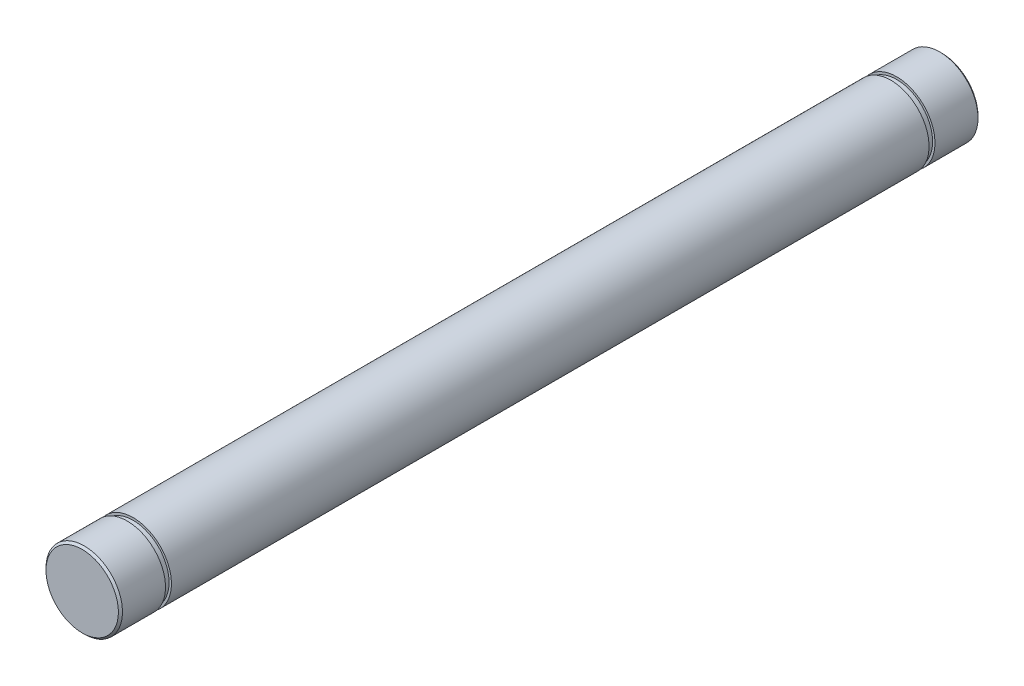
ISO-10303-21;
HEADER;
FILE_DESCRIPTION(('STEP AP214'),'2;1');
FILE_NAME('part.step','',(''),(''),'','','');
FILE_SCHEMA(('AUTOMOTIVE_DESIGN { 1 0 10303 214 1 1 1 1 }'));
ENDSEC;
DATA;
#1=APPLICATION_CONTEXT('core data for automotive mechanical design processes');
#2=APPLICATION_PROTOCOL_DEFINITION('international standard','automotive_design',2000,#1);
#3=PRODUCT_CONTEXT('',#1,'mechanical');
#4=PRODUCT('Part','Part','',(#3));
#5=PRODUCT_RELATED_PRODUCT_CATEGORY('part','',(#4));
#6=PRODUCT_DEFINITION_FORMATION('','',#4);
#7=PRODUCT_DEFINITION_CONTEXT('part definition',#1,'design');
#8=PRODUCT_DEFINITION('design','',#6,#7);
#9=PRODUCT_DEFINITION_SHAPE('','',#8);
#10=(LENGTH_UNIT() NAMED_UNIT(*) SI_UNIT(.MILLI.,.METRE.));
#11=(NAMED_UNIT(*) PLANE_ANGLE_UNIT() SI_UNIT($,.RADIAN.));
#12=(NAMED_UNIT(*) SI_UNIT($,.STERADIAN.) SOLID_ANGLE_UNIT());
#13=UNCERTAINTY_MEASURE_WITH_UNIT(LENGTH_MEASURE(1.E-05),#10,'distance_accuracy_value','');
#14=(GEOMETRIC_REPRESENTATION_CONTEXT(3) GLOBAL_UNCERTAINTY_ASSIGNED_CONTEXT((#13)) GLOBAL_UNIT_ASSIGNED_CONTEXT((#10,
#11,#12)) REPRESENTATION_CONTEXT('',''));
#15=CARTESIAN_POINT('',(0.,0.,0.));
#16=DIRECTION('',(0.,0.,1.));
#17=DIRECTION('',(1.,0.,0.));
#18=AXIS2_PLACEMENT_3D('',#15,#16,#17);
#19=CARTESIAN_POINT('',(0.,0.,107.061));
#20=DIRECTION('',(0.,0.,-1.));
#21=DIRECTION('',(-1.,0.,0.));
#22=AXIS2_PLACEMENT_3D('',#19,#20,#21);
#23=CYLINDRICAL_SURFACE('',#22,4.7625);
#24=CARTESIAN_POINT('',(0.,0.,100.711));
#25=DIRECTION('',(0.,0.,1.));
#26=DIRECTION('',(1.,0.,0.));
#27=AXIS2_PLACEMENT_3D('',#24,#25,#26);
#28=CIRCLE('',#27,4.7625);
#29=CARTESIAN_POINT('',(-4.7625,0.,100.711));
#30=VERTEX_POINT('',#29);
#31=EDGE_CURVE('E62',#30,#30,#28,.T.);
#32=CARTESIAN_POINT('',(0.,0.,6.34999999999999));
#33=DIRECTION('',(0.,0.,-1.));
#34=DIRECTION('',(-1.,0.,0.));
#35=AXIS2_PLACEMENT_3D('',#32,#33,#34);
#36=CIRCLE('',#35,4.7625);
#37=CARTESIAN_POINT('',(-4.7625,0.,6.35000000000001));
#38=VERTEX_POINT('',#37);
#39=EDGE_CURVE('E56',#38,#38,#36,.T.);
#40=CARTESIAN_POINT('',(-4.7625,0.,100.711));
#41=CARTESIAN_POINT('',(-4.7625,0.,99.7280729166666));
#42=CARTESIAN_POINT('',(-4.7625,0.,98.7451458333333));
#43=CARTESIAN_POINT('',(-4.7625,0.,96.7792916666667));
#44=CARTESIAN_POINT('',(-4.7625,0.,95.7963645833333));
#45=CARTESIAN_POINT('',(-4.7625,0.,93.8305104166667));
#46=CARTESIAN_POINT('',(-4.7625,0.,92.8475833333333));
#47=CARTESIAN_POINT('',(-4.7625,0.,90.8817291666666));
#48=CARTESIAN_POINT('',(-4.7625,0.,89.8988020833333));
#49=CARTESIAN_POINT('',(-4.7625,0.,87.9329479166667));
#50=CARTESIAN_POINT('',(-4.7625,0.,86.9500208333333));
#51=CARTESIAN_POINT('',(-4.7625,0.,84.9841666666667));
#52=CARTESIAN_POINT('',(-4.7625,0.,84.0012395833333));
#53=CARTESIAN_POINT('',(-4.7625,0.,82.0353854166667));
#54=CARTESIAN_POINT('',(-4.7625,0.,81.0524583333333));
#55=CARTESIAN_POINT('',(-4.7625,0.,79.0866041666667));
#56=CARTESIAN_POINT('',(-4.7625,0.,78.1036770833333));
#57=CARTESIAN_POINT('',(-4.7625,0.,76.1378229166667));
#58=CARTESIAN_POINT('',(-4.7625,0.,75.1548958333333));
#59=CARTESIAN_POINT('',(-4.7625,0.,73.1890416666667));
#60=CARTESIAN_POINT('',(-4.7625,0.,72.2061145833333));
#61=CARTESIAN_POINT('',(-4.7625,0.,70.2402604166667));
#62=CARTESIAN_POINT('',(-4.7625,0.,69.2573333333333));
#63=CARTESIAN_POINT('',(-4.7625,0.,67.2914791666667));
#64=CARTESIAN_POINT('',(-4.7625,0.,66.3085520833333));
#65=CARTESIAN_POINT('',(-4.7625,0.,64.3426979166667));
#66=CARTESIAN_POINT('',(-4.7625,0.,63.3597708333333));
#67=CARTESIAN_POINT('',(-4.7625,0.,61.3939166666667));
#68=CARTESIAN_POINT('',(-4.7625,0.,60.4109895833333));
#69=CARTESIAN_POINT('',(-4.7625,0.,58.4451354166667));
#70=CARTESIAN_POINT('',(-4.7625,0.,57.4622083333333));
#71=CARTESIAN_POINT('',(-4.7625,0.,55.4963541666667));
#72=CARTESIAN_POINT('',(-4.7625,0.,54.5134270833333));
#73=CARTESIAN_POINT('',(-4.7625,0.,52.5475729166667));
#74=CARTESIAN_POINT('',(-4.7625,0.,51.5646458333333));
#75=CARTESIAN_POINT('',(-4.7625,0.,49.5987916666667));
#76=CARTESIAN_POINT('',(-4.7625,0.,48.6158645833333));
#77=CARTESIAN_POINT('',(-4.7625,0.,46.6500104166667));
#78=CARTESIAN_POINT('',(-4.7625,0.,45.6670833333333));
#79=CARTESIAN_POINT('',(-4.7625,0.,43.7012291666667));
#80=CARTESIAN_POINT('',(-4.7625,0.,42.7183020833333));
#81=CARTESIAN_POINT('',(-4.7625,0.,40.7524479166667));
#82=CARTESIAN_POINT('',(-4.7625,0.,39.7695208333333));
#83=CARTESIAN_POINT('',(-4.7625,0.,37.8036666666667));
#84=CARTESIAN_POINT('',(-4.7625,0.,36.8207395833333));
#85=CARTESIAN_POINT('',(-4.7625,0.,34.8548854166667));
#86=CARTESIAN_POINT('',(-4.7625,0.,33.8719583333333));
#87=CARTESIAN_POINT('',(-4.7625,0.,31.9061041666667));
#88=CARTESIAN_POINT('',(-4.7625,0.,30.9231770833333));
#89=CARTESIAN_POINT('',(-4.7625,0.,28.9573229166667));
#90=CARTESIAN_POINT('',(-4.7625,0.,27.9743958333333));
#91=CARTESIAN_POINT('',(-4.7625,0.,26.0085416666667));
#92=CARTESIAN_POINT('',(-4.7625,0.,25.0256145833333));
#93=CARTESIAN_POINT('',(-4.7625,0.,23.0597604166667));
#94=CARTESIAN_POINT('',(-4.7625,0.,22.0768333333333));
#95=CARTESIAN_POINT('',(-4.7625,0.,20.1109791666667));
#96=CARTESIAN_POINT('',(-4.7625,0.,19.1280520833333));
#97=CARTESIAN_POINT('',(-4.7625,0.,17.1621979166667));
#98=CARTESIAN_POINT('',(-4.7625,0.,16.1792708333333));
#99=CARTESIAN_POINT('',(-4.7625,0.,14.2134166666667));
#100=CARTESIAN_POINT('',(-4.7625,0.,13.2304895833333));
#101=CARTESIAN_POINT('',(-4.7625,0.,11.2646354166667));
#102=CARTESIAN_POINT('',(-4.7625,0.,10.2817083333333));
#103=CARTESIAN_POINT('',(-4.7625,0.,8.31585416666668));
#104=CARTESIAN_POINT('',(-4.7625,0.,7.33292708333334));
#105=CARTESIAN_POINT('',(-4.7625,0.,6.35000000000001));
#106=B_SPLINE_CURVE_WITH_KNOTS('',3,(#40,#41,#42,#43,#44,#45,#46,#47,#48,#49,#50,#51,#52,#53,
#54,#55,#56,#57,#58,#59,#60,#61,#62,#63,#64,#65,#66,#67,#68,#69,#70,#71,#72,#73,#74,#75,#76,#77,
#78,#79,#80,#81,#82,#83,#84,#85,#86,#87,#88,#89,#90,#91,#92,#93,#94,#95,#96,#97,#98,#99,#100,
#101,#102,#103,#104,#105),.UNSPECIFIED.,.F.,.F.,(4,2,2,2,2,2,2,2,2,2,2,2,2,2,2,2,2,2,2,2,2,2,2,
2,2,2,2,2,2,2,2,2,4),(0.,2.94878124999999,5.89756249999999,8.84634375,11.795125,14.74390625,
17.6926875,20.64146875,23.59025,26.53903125,29.4878125,32.43659375,35.385375,38.33415625,
41.2829375,44.23171875,47.1805,50.12928125,53.0780625,56.02684375,58.975625,61.92440625,
64.8731875,67.82196875,70.77075,73.71953125,76.6683125,79.61709375,82.565875,85.51465625,
88.4634375,91.41221875,94.361),.UNSPECIFIED.);
#107=EDGE_CURVE('BSEAM31',#30,#38,#106,.T.);
#108=ORIENTED_EDGE('',*,*,#31,.F.);
#109=ORIENTED_EDGE('',*,*,#39,.F.);
#110=ORIENTED_EDGE('',*,*,#107,.T.);
#111=ORIENTED_EDGE('',*,*,#107,.F.);
#112=EDGE_LOOP('',(#108,#110,#109,#111));
#113=FACE_BOUND('',#112,.T.);
#114=ADVANCED_FACE('F31',(#113),#23,.T.);
#115=CARTESIAN_POINT('',(0.,0.,106.807));
#116=DIRECTION('',(0.,0.,1.));
#117=DIRECTION('',(1.,0.,0.));
#118=AXIS2_PLACEMENT_3D('',#115,#116,#117);
#119=CIRCLE('',#118,4.7625);
#120=CARTESIAN_POINT('',(-4.7625,0.,106.807));
#121=VERTEX_POINT('',#120);
#122=EDGE_CURVE('E42',#121,#121,#119,.F.);
#123=CARTESIAN_POINT('',(0.,0.,101.4476));
#124=DIRECTION('',(0.,0.,1.));
#125=DIRECTION('',(1.,0.,0.));
#126=AXIS2_PLACEMENT_3D('',#123,#124,#125);
#127=CIRCLE('',#126,4.7625);
#128=CARTESIAN_POINT('',(-4.7625,0.,101.4476));
#129=VERTEX_POINT('',#128);
#130=EDGE_CURVE('E51',#129,#129,#127,.T.);
#131=CARTESIAN_POINT('',(-4.7625,0.,106.807));
#132=CARTESIAN_POINT('',(-4.7625,0.,106.751172916667));
#133=CARTESIAN_POINT('',(-4.7625,0.,106.695345833333));
#134=CARTESIAN_POINT('',(-4.7625,0.,106.583691666667));
#135=CARTESIAN_POINT('',(-4.7625,0.,106.527864583333));
#136=CARTESIAN_POINT('',(-4.7625,0.,106.416210416667));
#137=CARTESIAN_POINT('',(-4.7625,0.,106.360383333333));
#138=CARTESIAN_POINT('',(-4.7625,0.,106.248729166667));
#139=CARTESIAN_POINT('',(-4.7625,0.,106.192902083333));
#140=CARTESIAN_POINT('',(-4.7625,0.,106.081247916667));
#141=CARTESIAN_POINT('',(-4.7625,0.,106.025420833333));
#142=CARTESIAN_POINT('',(-4.7625,0.,105.913766666667));
#143=CARTESIAN_POINT('',(-4.7625,0.,105.857939583333));
#144=CARTESIAN_POINT('',(-4.7625,0.,105.746285416667));
#145=CARTESIAN_POINT('',(-4.7625,0.,105.690458333333));
#146=CARTESIAN_POINT('',(-4.7625,0.,105.578804166667));
#147=CARTESIAN_POINT('',(-4.7625,0.,105.522977083333));
#148=CARTESIAN_POINT('',(-4.7625,0.,105.411322916667));
#149=CARTESIAN_POINT('',(-4.7625,0.,105.355495833333));
#150=CARTESIAN_POINT('',(-4.7625,0.,105.243841666667));
#151=CARTESIAN_POINT('',(-4.7625,0.,105.188014583333));
#152=CARTESIAN_POINT('',(-4.7625,0.,105.076360416667));
#153=CARTESIAN_POINT('',(-4.7625,0.,105.020533333333));
#154=CARTESIAN_POINT('',(-4.7625,0.,104.908879166667));
#155=CARTESIAN_POINT('',(-4.7625,0.,104.853052083333));
#156=CARTESIAN_POINT('',(-4.7625,0.,104.741397916667));
#157=CARTESIAN_POINT('',(-4.7625,0.,104.685570833333));
#158=CARTESIAN_POINT('',(-4.7625,0.,104.573916666667));
#159=CARTESIAN_POINT('',(-4.7625,0.,104.518089583333));
#160=CARTESIAN_POINT('',(-4.7625,0.,104.406435416667));
#161=CARTESIAN_POINT('',(-4.7625,0.,104.350608333333));
#162=CARTESIAN_POINT('',(-4.7625,0.,104.238954166667));
#163=CARTESIAN_POINT('',(-4.7625,0.,104.183127083333));
#164=CARTESIAN_POINT('',(-4.7625,0.,104.071472916667));
#165=CARTESIAN_POINT('',(-4.7625,0.,104.015645833333));
#166=CARTESIAN_POINT('',(-4.7625,0.,103.903991666667));
#167=CARTESIAN_POINT('',(-4.7625,0.,103.848164583333));
#168=CARTESIAN_POINT('',(-4.7625,0.,103.736510416667));
#169=CARTESIAN_POINT('',(-4.7625,0.,103.680683333333));
#170=CARTESIAN_POINT('',(-4.7625,0.,103.569029166667));
#171=CARTESIAN_POINT('',(-4.7625,0.,103.513202083333));
#172=CARTESIAN_POINT('',(-4.7625,0.,103.401547916667));
#173=CARTESIAN_POINT('',(-4.7625,0.,103.345720833333));
#174=CARTESIAN_POINT('',(-4.7625,0.,103.234066666667));
#175=CARTESIAN_POINT('',(-4.7625,0.,103.178239583333));
#176=CARTESIAN_POINT('',(-4.7625,0.,103.066585416667));
#177=CARTESIAN_POINT('',(-4.7625,0.,103.010758333333));
#178=CARTESIAN_POINT('',(-4.7625,0.,102.899104166667));
#179=CARTESIAN_POINT('',(-4.7625,0.,102.843277083333));
#180=CARTESIAN_POINT('',(-4.7625,0.,102.731622916667));
#181=CARTESIAN_POINT('',(-4.7625,0.,102.675795833333));
#182=CARTESIAN_POINT('',(-4.7625,0.,102.564141666667));
#183=CARTESIAN_POINT('',(-4.7625,0.,102.508314583333));
#184=CARTESIAN_POINT('',(-4.7625,0.,102.396660416667));
#185=CARTESIAN_POINT('',(-4.7625,0.,102.340833333333));
#186=CARTESIAN_POINT('',(-4.7625,0.,102.229179166667));
#187=CARTESIAN_POINT('',(-4.7625,0.,102.173352083333));
#188=CARTESIAN_POINT('',(-4.7625,0.,102.061697916667));
#189=CARTESIAN_POINT('',(-4.7625,0.,102.005870833333));
#190=CARTESIAN_POINT('',(-4.7625,0.,101.894216666667));
#191=CARTESIAN_POINT('',(-4.7625,0.,101.838389583333));
#192=CARTESIAN_POINT('',(-4.7625,0.,101.726735416667));
#193=CARTESIAN_POINT('',(-4.7625,0.,101.670908333333));
#194=CARTESIAN_POINT('',(-4.7625,0.,101.559254166667));
#195=CARTESIAN_POINT('',(-4.7625,0.,101.503427083333));
#196=CARTESIAN_POINT('',(-4.7625,0.,101.4476));
#197=B_SPLINE_CURVE_WITH_KNOTS('',3,(#131,#132,#133,#134,#135,#136,#137,#138,#139,#140,#141,
#142,#143,#144,#145,#146,#147,#148,#149,#150,#151,#152,#153,#154,#155,#156,#157,#158,#159,#160,
#161,#162,#163,#164,#165,#166,#167,#168,#169,#170,#171,#172,#173,#174,#175,#176,#177,#178,#179,
#180,#181,#182,#183,#184,#185,#186,#187,#188,#189,#190,#191,#192,#193,#194,#195,#196),
.UNSPECIFIED.,.F.,.F.,(4,2,2,2,2,2,2,2,2,2,2,2,2,2,2,2,2,2,2,2,2,2,2,2,2,2,2,2,2,2,2,2,4),(0.,
0.167481250000004,0.334962500000008,0.502443750000012,0.669925000000016,0.837406250000006,
1.00488750000001,1.17236875000001,1.33985000000002,1.50733125000002,1.67481250000001,
1.84229375000002,2.00977500000002,2.17725625000002,2.34473750000001,2.51221875000002,
2.67970000000002,2.84718125000003,3.01466250000003,3.18214375000002,3.34962500000002,
3.51710625000003,3.68458750000003,3.85206875000003,4.01955000000002,4.18703125000003,
4.35451250000003,4.52199375000004,4.68947500000003,4.85695625000003,5.02443750000003,
5.19191875000004,5.35940000000004),.UNSPECIFIED.);
#198=EDGE_CURVE('BSEAM93',#121,#129,#197,.T.);
#199=ORIENTED_EDGE('',*,*,#122,.T.);
#200=ORIENTED_EDGE('',*,*,#130,.T.);
#201=ORIENTED_EDGE('',*,*,#198,.T.);
#202=ORIENTED_EDGE('',*,*,#198,.F.);
#203=EDGE_LOOP('',(#199,#201,#200,#202));
#204=FACE_BOUND('',#203,.T.);
#205=ADVANCED_FACE('F93',(#204),#23,.T.);
#206=CARTESIAN_POINT('',(0.,0.,107.061));
#207=DIRECTION('',(0.,0.,1.));
#208=DIRECTION('',(1.,0.,0.));
#209=AXIS2_PLACEMENT_3D('',#206,#207,#208);
#210=PLANE('',#209);
#211=CARTESIAN_POINT('',(0.,0.,107.061));
#212=DIRECTION('',(0.,0.,1.));
#213=DIRECTION('',(1.,0.,0.));
#214=AXIS2_PLACEMENT_3D('',#211,#212,#213);
#215=CIRCLE('',#214,4.50850000000004);
#216=CARTESIAN_POINT('',(4.50850000000004,0.,107.061));
#217=VERTEX_POINT('',#216);
#218=EDGE_CURVE('E46',#217,#217,#215,.T.);
#219=ORIENTED_EDGE('',*,*,#218,.T.);
#220=EDGE_LOOP('',(#219));
#221=FACE_BOUND('',#220,.T.);
#222=ADVANCED_FACE('F100',(#221),#210,.T.);
#223=CARTESIAN_POINT('',(0.,0.,101.4476));
#224=DIRECTION('',(0.,0.,1.));
#225=DIRECTION('',(1.,0.,0.));
#226=AXIS2_PLACEMENT_3D('',#223,#224,#225);
#227=PLANE('',#226);
#228=CARTESIAN_POINT('',(0.,0.,101.4476));
#229=DIRECTION('',(0.,0.,1.));
#230=DIRECTION('',(1.,0.,0.));
#231=AXIS2_PLACEMENT_3D('',#228,#229,#230);
#232=CIRCLE('',#231,4.4704);
#233=CARTESIAN_POINT('',(4.4704,0.,101.4476));
#234=VERTEX_POINT('',#233);
#235=EDGE_CURVE('E65',#234,#234,#232,.T.);
#236=ORIENTED_EDGE('',*,*,#235,.T.);
#237=EDGE_LOOP('',(#236));
#238=FACE_BOUND('',#237,.T.);
#239=ORIENTED_EDGE('',*,*,#130,.F.);
#240=EDGE_LOOP('',(#239));
#241=FACE_BOUND('',#240,.T.);
#242=ADVANCED_FACE('F123',(#238,#241),#227,.F.);
#243=CARTESIAN_POINT('',(0.,0.,100.711));
#244=DIRECTION('',(0.,0.,1.));
#245=DIRECTION('',(1.,0.,0.));
#246=AXIS2_PLACEMENT_3D('',#243,#244,#245);
#247=PLANE('',#246);
#248=CARTESIAN_POINT('',(0.,0.,100.711));
#249=DIRECTION('',(0.,0.,1.));
#250=DIRECTION('',(1.,0.,0.));
#251=AXIS2_PLACEMENT_3D('',#248,#249,#250);
#252=CIRCLE('',#251,4.4704);
#253=CARTESIAN_POINT('',(4.4704,0.,100.711));
#254=VERTEX_POINT('',#253);
#255=EDGE_CURVE('E55',#254,#254,#252,.T.);
#256=ORIENTED_EDGE('',*,*,#255,.F.);
#257=EDGE_LOOP('',(#256));
#258=FACE_BOUND('',#257,.T.);
#259=ORIENTED_EDGE('',*,*,#31,.T.);
#260=EDGE_LOOP('',(#259));
#261=FACE_BOUND('',#260,.T.);
#262=ADVANCED_FACE('F119',(#258,#261),#247,.T.);
#263=CARTESIAN_POINT('',(0.,0.,101.4476));
#264=DIRECTION('',(0.,0.,-1.));
#265=DIRECTION('',(-1.,0.,0.));
#266=AXIS2_PLACEMENT_3D('',#263,#264,#265);
#267=CYLINDRICAL_SURFACE('',#266,4.4704);
#268=ORIENTED_EDGE('',*,*,#235,.F.);
#269=EDGE_LOOP('',(#268));
#270=FACE_BOUND('',#269,.T.);
#271=ORIENTED_EDGE('',*,*,#255,.T.);
#272=EDGE_LOOP('',(#271));
#273=FACE_BOUND('',#272,.T.);
#274=ADVANCED_FACE('F114',(#270,#273),#267,.T.);
#275=CARTESIAN_POINT('',(0.,0.,5.6134));
#276=DIRECTION('',(0.,0.,-1.));
#277=DIRECTION('',(-1.,0.,0.));
#278=AXIS2_PLACEMENT_3D('',#275,#276,#277);
#279=PLANE('',#278);
#280=CARTESIAN_POINT('',(0.,0.,5.6134));
#281=DIRECTION('',(0.,0.,-1.));
#282=DIRECTION('',(-1.,0.,0.));
#283=AXIS2_PLACEMENT_3D('',#280,#281,#282);
#284=CIRCLE('',#283,4.4704);
#285=CARTESIAN_POINT('',(-4.4704,0.,5.6134));
#286=VERTEX_POINT('',#285);
#287=EDGE_CURVE('E59',#286,#286,#284,.T.);
#288=ORIENTED_EDGE('',*,*,#287,.T.);
#289=EDGE_LOOP('',(#288));
#290=FACE_BOUND('',#289,.T.);
#291=CARTESIAN_POINT('',(0.,0.,5.6134));
#292=DIRECTION('',(0.,0.,-1.));
#293=DIRECTION('',(-1.,0.,0.));
#294=AXIS2_PLACEMENT_3D('',#291,#292,#293);
#295=CIRCLE('',#294,4.7625);
#296=CARTESIAN_POINT('',(-4.7625,0.,5.6134));
#297=VERTEX_POINT('',#296);
#298=EDGE_CURVE('E52',#297,#297,#295,.T.);
#299=ORIENTED_EDGE('',*,*,#298,.F.);
#300=EDGE_LOOP('',(#299));
#301=FACE_BOUND('',#300,.T.);
#302=ADVANCED_FACE('F76',(#290,#301),#279,.F.);
#303=CARTESIAN_POINT('',(0.,0.,6.35));
#304=DIRECTION('',(0.,0.,-1.));
#305=DIRECTION('',(-1.,0.,0.));
#306=AXIS2_PLACEMENT_3D('',#303,#304,#305);
#307=PLANE('',#306);
#308=CARTESIAN_POINT('',(0.,0.,6.35));
#309=DIRECTION('',(0.,0.,-1.));
#310=DIRECTION('',(-1.,0.,0.));
#311=AXIS2_PLACEMENT_3D('',#308,#309,#310);
#312=CIRCLE('',#311,4.4704);
#313=CARTESIAN_POINT('',(-4.4704,0.,6.35));
#314=VERTEX_POINT('',#313);
#315=EDGE_CURVE('E70',#314,#314,#312,.T.);
#316=ORIENTED_EDGE('',*,*,#315,.F.);
#317=EDGE_LOOP('',(#316));
#318=FACE_BOUND('',#317,.T.);
#319=ORIENTED_EDGE('',*,*,#39,.T.);
#320=EDGE_LOOP('',(#319));
#321=FACE_BOUND('',#320,.T.);
#322=ADVANCED_FACE('F83',(#318,#321),#307,.T.);
#323=CARTESIAN_POINT('',(0.,0.,5.6134));
#324=DIRECTION('',(0.,0.,1.));
#325=DIRECTION('',(1.,0.,0.));
#326=AXIS2_PLACEMENT_3D('',#323,#324,#325);
#327=CYLINDRICAL_SURFACE('',#326,4.4704);
#328=ORIENTED_EDGE('',*,*,#287,.F.);
#329=EDGE_LOOP('',(#328));
#330=FACE_BOUND('',#329,.T.);
#331=ORIENTED_EDGE('',*,*,#315,.T.);
#332=EDGE_LOOP('',(#331));
#333=FACE_BOUND('',#332,.T.);
#334=ADVANCED_FACE('F79',(#330,#333),#327,.T.);
#335=CARTESIAN_POINT('',(0.,0.,0.));
#336=DIRECTION('',(0.,0.,1.));
#337=DIRECTION('',(1.,0.,0.));
#338=AXIS2_PLACEMENT_3D('',#335,#336,#337);
#339=PLANE('',#338);
#340=CARTESIAN_POINT('',(0.,0.,0.));
#341=DIRECTION('',(0.,0.,1.));
#342=DIRECTION('',(1.,0.,0.));
#343=AXIS2_PLACEMENT_3D('',#340,#341,#342);
#344=CIRCLE('',#343,4.50849999999989);
#345=CARTESIAN_POINT('',(4.50849999999989,0.,0.));
#346=VERTEX_POINT('',#345);
#347=EDGE_CURVE('E10',#346,#346,#344,.F.);
#348=ORIENTED_EDGE('',*,*,#347,.T.);
#349=EDGE_LOOP('',(#348));
#350=FACE_BOUND('',#349,.T.);
#351=ADVANCED_FACE('F82',(#350),#339,.F.);
#352=CARTESIAN_POINT('',(0.,0.,0.254000000000129));
#353=DIRECTION('',(0.,0.,1.));
#354=DIRECTION('',(1.,0.,0.));
#355=AXIS2_PLACEMENT_3D('',#352,#353,#354);
#356=CIRCLE('',#355,4.7625);
#357=CARTESIAN_POINT('',(-4.7625,0.,0.254000000000129));
#358=VERTEX_POINT('',#357);
#359=EDGE_CURVE('E38',#358,#358,#356,.T.);
#360=CARTESIAN_POINT('',(-4.7625,0.,0.254000000000129));
#361=CARTESIAN_POINT('',(-4.7625,0.,0.309827083333459));
#362=CARTESIAN_POINT('',(-4.7625,0.,0.365654166666789));
#363=CARTESIAN_POINT('',(-4.7625,0.,0.477308333333454));
#364=CARTESIAN_POINT('',(-4.7625,0.,0.533135416666788));
#365=CARTESIAN_POINT('',(-4.7625,0.,0.644789583333453));
#366=CARTESIAN_POINT('',(-4.7625,0.,0.700616666666783));
#367=CARTESIAN_POINT('',(-4.7625,0.,0.812270833333448));
#368=CARTESIAN_POINT('',(-4.7625,0.,0.868097916666782));
#369=CARTESIAN_POINT('',(-4.7625,0.,0.979752083333447));
#370=CARTESIAN_POINT('',(-4.7625,0.,1.03557916666678));
#371=CARTESIAN_POINT('',(-4.7625,0.,1.14723333333344));
#372=CARTESIAN_POINT('',(-4.7625,0.,1.20306041666678));
#373=CARTESIAN_POINT('',(-4.7625,0.,1.31471458333344));
#374=CARTESIAN_POINT('',(-4.7625,0.,1.37054166666677));
#375=CARTESIAN_POINT('',(-4.7625,0.,1.48219583333344));
#376=CARTESIAN_POINT('',(-4.7625,0.,1.53802291666677));
#377=CARTESIAN_POINT('',(-4.7625,0.,1.64967708333343));
#378=CARTESIAN_POINT('',(-4.7625,0.,1.70550416666676));
#379=CARTESIAN_POINT('',(-4.7625,0.,1.81715833333342));
#380=CARTESIAN_POINT('',(-4.7625,0.,1.87298541666675));
#381=CARTESIAN_POINT('',(-4.7625,0.,1.98463958333342));
#382=CARTESIAN_POINT('',(-4.7625,0.,2.04046666666675));
#383=CARTESIAN_POINT('',(-4.7625,0.,2.15212083333342));
#384=CARTESIAN_POINT('',(-4.7625,0.,2.20794791666675));
#385=CARTESIAN_POINT('',(-4.7625,0.,2.31960208333341));
#386=CARTESIAN_POINT('',(-4.7625,0.,2.37542916666675));
#387=CARTESIAN_POINT('',(-4.7625,0.,2.48708333333341));
#388=CARTESIAN_POINT('',(-4.7625,0.,2.54291041666674));
#389=CARTESIAN_POINT('',(-4.7625,0.,2.65456458333341));
#390=CARTESIAN_POINT('',(-4.7625,0.,2.71039166666674));
#391=CARTESIAN_POINT('',(-4.7625,0.,2.82204583333341));
#392=CARTESIAN_POINT('',(-4.7625,0.,2.87787291666674));
#393=CARTESIAN_POINT('',(-4.7625,0.,2.9895270833334));
#394=CARTESIAN_POINT('',(-4.7625,0.,3.04535416666673));
#395=CARTESIAN_POINT('',(-4.7625,0.,3.15700833333339));
#396=CARTESIAN_POINT('',(-4.7625,0.,3.21283541666673));
#397=CARTESIAN_POINT('',(-4.7625,0.,3.32448958333339));
#398=CARTESIAN_POINT('',(-4.7625,0.,3.38031666666672));
#399=CARTESIAN_POINT('',(-4.7625,0.,3.49197083333339));
#400=CARTESIAN_POINT('',(-4.7625,0.,3.54779791666672));
#401=CARTESIAN_POINT('',(-4.7625,0.,3.65945208333338));
#402=CARTESIAN_POINT('',(-4.7625,0.,3.71527916666671));
#403=CARTESIAN_POINT('',(-4.7625,0.,3.82693333333338));
#404=CARTESIAN_POINT('',(-4.7625,0.,3.88276041666671));
#405=CARTESIAN_POINT('',(-4.7625,0.,3.99441458333338));
#406=CARTESIAN_POINT('',(-4.7625,0.,4.05024166666671));
#407=CARTESIAN_POINT('',(-4.7625,0.,4.16189583333337));
#408=CARTESIAN_POINT('',(-4.7625,0.,4.2177229166667));
#409=CARTESIAN_POINT('',(-4.7625,0.,4.32937708333336));
#410=CARTESIAN_POINT('',(-4.7625,0.,4.3852041666667));
#411=CARTESIAN_POINT('',(-4.7625,0.,4.49685833333336));
#412=CARTESIAN_POINT('',(-4.7625,0.,4.55268541666669));
#413=CARTESIAN_POINT('',(-4.7625,0.,4.66433958333336));
#414=CARTESIAN_POINT('',(-4.7625,0.,4.72016666666669));
#415=CARTESIAN_POINT('',(-4.7625,0.,4.83182083333336));
#416=CARTESIAN_POINT('',(-4.7625,0.,4.88764791666669));
#417=CARTESIAN_POINT('',(-4.7625,0.,4.99930208333335));
#418=CARTESIAN_POINT('',(-4.7625,0.,5.05512916666669));
#419=CARTESIAN_POINT('',(-4.7625,0.,5.16678333333335));
#420=CARTESIAN_POINT('',(-4.7625,0.,5.22261041666668));
#421=CARTESIAN_POINT('',(-4.7625,0.,5.33426458333335));
#422=CARTESIAN_POINT('',(-4.7625,0.,5.39009166666668));
#423=CARTESIAN_POINT('',(-4.7625,0.,5.50174583333335));
#424=CARTESIAN_POINT('',(-4.7625,0.,5.55757291666667));
#425=CARTESIAN_POINT('',(-4.7625,0.,5.6134));
#426=B_SPLINE_CURVE_WITH_KNOTS('',3,(#360,#361,#362,#363,#364,#365,#366,#367,#368,#369,#370,
#371,#372,#373,#374,#375,#376,#377,#378,#379,#380,#381,#382,#383,#384,#385,#386,#387,#388,#389,
#390,#391,#392,#393,#394,#395,#396,#397,#398,#399,#400,#401,#402,#403,#404,#405,#406,#407,#408,
#409,#410,#411,#412,#413,#414,#415,#416,#417,#418,#419,#420,#421,#422,#423,#424,#425),
.UNSPECIFIED.,.F.,.F.,(4,2,2,2,2,2,2,2,2,2,2,2,2,2,2,2,2,2,2,2,2,2,2,2,2,2,2,2,2,2,2,2,4),(0.,
0.16748124999999,0.334962499999994,0.502443749999984,0.669924999999988,0.837406249999978,
1.00488749999998,1.17236874999997,1.33984999999998,1.50733124999997,1.67481249999996,
1.84229374999996,2.00977499999995,2.17725624999995,2.34473749999994,2.51221874999995,
2.67969999999994,2.84718124999993,3.01466249999993,3.18214374999992,3.34962499999993,
3.51710624999992,3.68458749999992,3.85206874999991,4.0195499999999,4.1870312499999,
4.35451249999989,4.5219937499999,4.68947499999989,4.85695624999989,5.02443749999988,
5.19191874999989,5.35939999999988),.UNSPECIFIED.);
#427=EDGE_CURVE('BSEAM96',#358,#297,#426,.T.);
#428=ORIENTED_EDGE('',*,*,#359,.T.);
#429=ORIENTED_EDGE('',*,*,#298,.T.);
#430=ORIENTED_EDGE('',*,*,#427,.T.);
#431=ORIENTED_EDGE('',*,*,#427,.F.);
#432=EDGE_LOOP('',(#428,#430,#429,#431));
#433=FACE_BOUND('',#432,.T.);
#434=ADVANCED_FACE('F96',(#433),#23,.T.);
#435=CARTESIAN_POINT('',(0.,0.,107.061));
#436=DIRECTION('',(0.,0.,-1.));
#437=DIRECTION('',(-1.,0.,0.));
#438=AXIS2_PLACEMENT_3D('',#435,#436,#437);
#439=CONICAL_SURFACE('',#438,4.50850000000004,0.785398163397445);
#440=ORIENTED_EDGE('',*,*,#122,.F.);
#441=EDGE_LOOP('',(#440));
#442=FACE_BOUND('',#441,.T.);
#443=ORIENTED_EDGE('',*,*,#218,.F.);
#444=EDGE_LOOP('',(#443));
#445=FACE_BOUND('',#444,.T.);
#446=ADVANCED_FACE('F105',(#442,#445),#439,.T.);
#447=CARTESIAN_POINT('',(0.,0.,0.254000000000129));
#448=DIRECTION('',(0.,0.,1.));
#449=DIRECTION('',(1.,0.,0.));
#450=AXIS2_PLACEMENT_3D('',#447,#448,#449);
#451=CONICAL_SURFACE('',#450,4.7625,0.785398163397418);
#452=ORIENTED_EDGE('',*,*,#347,.F.);
#453=EDGE_LOOP('',(#452));
#454=FACE_BOUND('',#453,.T.);
#455=ORIENTED_EDGE('',*,*,#359,.F.);
#456=EDGE_LOOP('',(#455));
#457=FACE_BOUND('',#456,.T.);
#458=ADVANCED_FACE('F33',(#454,#457),#451,.T.);
#459=CLOSED_SHELL('',(#114,#205,#222,#242,#262,#274,#302,#322,#334,#351,#434,#446,#458));
#460=MANIFOLD_SOLID_BREP('B2',#459);
#461=ADVANCED_BREP_SHAPE_REPRESENTATION('',(#18,#460),#14);
#462=SHAPE_DEFINITION_REPRESENTATION(#9,#461);
ENDSEC;
END-ISO-10303-21;
